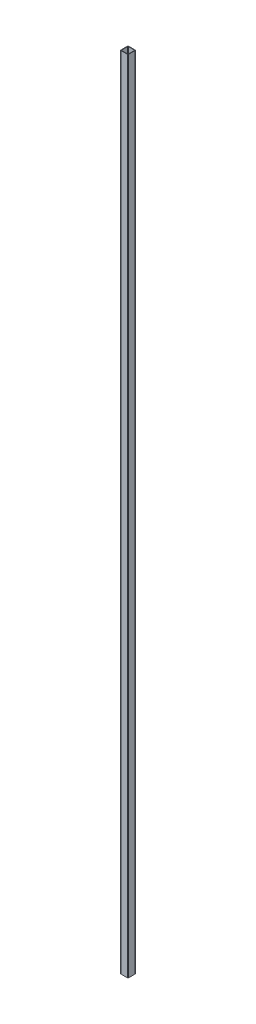
ISO-10303-21;
HEADER;
FILE_DESCRIPTION(('STEP AP214'),'2;1');
FILE_NAME('part.step','',(''),(''),'','','');
FILE_SCHEMA(('AUTOMOTIVE_DESIGN { 1 0 10303 214 1 1 1 1 }'));
ENDSEC;
DATA;
#1=APPLICATION_CONTEXT('core data for automotive mechanical design processes');
#2=APPLICATION_PROTOCOL_DEFINITION('international standard','automotive_design',2000,#1);
#3=PRODUCT_CONTEXT('',#1,'mechanical');
#4=PRODUCT('Part','Part','',(#3));
#5=PRODUCT_RELATED_PRODUCT_CATEGORY('part','',(#4));
#6=PRODUCT_DEFINITION_FORMATION('','',#4);
#7=PRODUCT_DEFINITION_CONTEXT('part definition',#1,'design');
#8=PRODUCT_DEFINITION('design','',#6,#7);
#9=PRODUCT_DEFINITION_SHAPE('','',#8);
#10=(LENGTH_UNIT() NAMED_UNIT(*) SI_UNIT(.MILLI.,.METRE.));
#11=(NAMED_UNIT(*) PLANE_ANGLE_UNIT() SI_UNIT($,.RADIAN.));
#12=(NAMED_UNIT(*) SI_UNIT($,.STERADIAN.) SOLID_ANGLE_UNIT());
#13=UNCERTAINTY_MEASURE_WITH_UNIT(LENGTH_MEASURE(1.E-05),#10,'distance_accuracy_value','');
#14=(GEOMETRIC_REPRESENTATION_CONTEXT(3) GLOBAL_UNCERTAINTY_ASSIGNED_CONTEXT((#13)) GLOBAL_UNIT_ASSIGNED_CONTEXT((#10,
#11,#12)) REPRESENTATION_CONTEXT('',''));
#15=CARTESIAN_POINT('',(0.,0.,0.));
#16=DIRECTION('',(0.,0.,1.));
#17=DIRECTION('',(1.,0.,0.));
#18=AXIS2_PLACEMENT_3D('',#15,#16,#17);
#19=CARTESIAN_POINT('',(18.,4240.,18.));
#20=DIRECTION('',(0.,-1.,0.));
#21=DIRECTION('',(0.,0.,-1.));
#22=AXIS2_PLACEMENT_3D('',#19,#20,#21);
#23=PLANE('',#22);
#24=CARTESIAN_POINT('',(18.,4240.,18.));
#25=DIRECTION('',(0.,1.,0.));
#26=DIRECTION('',(0.,0.,-1.));
#27=AXIS2_PLACEMENT_3D('',#24,#25,#26);
#28=CIRCLE('',#27,2.);
#29=CARTESIAN_POINT('',(18.,4240.,20.));
#30=VERTEX_POINT('',#29);
#31=CARTESIAN_POINT('',(20.,4240.,18.));
#32=VERTEX_POINT('',#31);
#33=EDGE_CURVE('E213',#30,#32,#28,.T.);
#34=ORIENTED_EDGE('',*,*,#33,.T.);
#35=DIRECTION('',(0.,0.,-1.));
#36=VECTOR('',#35,1.);
#37=CARTESIAN_POINT('',(20.,4240.,-18.));
#38=LINE('',#37,#36);
#39=CARTESIAN_POINT('',(20.,4240.,-18.));
#40=VERTEX_POINT('',#39);
#41=EDGE_CURVE('E216',#32,#40,#38,.T.);
#42=ORIENTED_EDGE('',*,*,#41,.T.);
#43=CARTESIAN_POINT('',(18.,4240.,-18.));
#44=DIRECTION('',(0.,1.,0.));
#45=DIRECTION('',(0.,0.,-1.));
#46=AXIS2_PLACEMENT_3D('',#43,#44,#45);
#47=CIRCLE('',#46,2.);
#48=CARTESIAN_POINT('',(18.,4240.,-20.));
#49=VERTEX_POINT('',#48);
#50=EDGE_CURVE('E219',#40,#49,#47,.T.);
#51=ORIENTED_EDGE('',*,*,#50,.T.);
#52=DIRECTION('',(-1.,0.,0.));
#53=VECTOR('',#52,1.);
#54=CARTESIAN_POINT('',(18.,4240.,-20.));
#55=LINE('',#54,#53);
#56=CARTESIAN_POINT('',(-18.,4240.,-20.));
#57=VERTEX_POINT('',#56);
#58=EDGE_CURVE('E221',#49,#57,#55,.T.);
#59=ORIENTED_EDGE('',*,*,#58,.T.);
#60=CARTESIAN_POINT('',(-18.,4240.,-18.));
#61=DIRECTION('',(0.,1.,0.));
#62=DIRECTION('',(0.,0.,1.));
#63=AXIS2_PLACEMENT_3D('',#60,#61,#62);
#64=CIRCLE('',#63,2.);
#65=CARTESIAN_POINT('',(-20.,4240.,-18.));
#66=VERTEX_POINT('',#65);
#67=EDGE_CURVE('E223',#57,#66,#64,.T.);
#68=ORIENTED_EDGE('',*,*,#67,.T.);
#69=DIRECTION('',(0.,0.,1.));
#70=VECTOR('',#69,1.);
#71=CARTESIAN_POINT('',(-20.,4240.,-18.));
#72=LINE('',#71,#70);
#73=CARTESIAN_POINT('',(-20.,4240.,18.));
#74=VERTEX_POINT('',#73);
#75=EDGE_CURVE('E225',#66,#74,#72,.T.);
#76=ORIENTED_EDGE('',*,*,#75,.T.);
#77=CARTESIAN_POINT('',(-18.,4240.,18.));
#78=DIRECTION('',(0.,1.,0.));
#79=DIRECTION('',(0.,0.,-1.));
#80=AXIS2_PLACEMENT_3D('',#77,#78,#79);
#81=CIRCLE('',#80,2.);
#82=CARTESIAN_POINT('',(-18.,4240.,20.));
#83=VERTEX_POINT('',#82);
#84=EDGE_CURVE('E227',#74,#83,#81,.T.);
#85=ORIENTED_EDGE('',*,*,#84,.T.);
#86=DIRECTION('',(1.,0.,0.));
#87=VECTOR('',#86,1.);
#88=CARTESIAN_POINT('',(18.,4240.,20.));
#89=LINE('',#88,#87);
#90=EDGE_CURVE('E229',#83,#30,#89,.T.);
#91=ORIENTED_EDGE('',*,*,#90,.T.);
#92=EDGE_LOOP('',(#34,#42,#51,#59,#68,#76,#85,#91));
#93=FACE_BOUND('',#92,.T.);
#94=CARTESIAN_POINT('',(16.,4240.,16.));
#95=DIRECTION('',(0.,1.,0.));
#96=DIRECTION('',(0.,0.,-1.));
#97=AXIS2_PLACEMENT_3D('',#94,#95,#96);
#98=CIRCLE('',#97,2.);
#99=CARTESIAN_POINT('',(16.,4240.,18.));
#100=VERTEX_POINT('',#99);
#101=CARTESIAN_POINT('',(18.,4240.,16.));
#102=VERTEX_POINT('',#101);
#103=EDGE_CURVE('E148',#100,#102,#98,.T.);
#104=ORIENTED_EDGE('',*,*,#103,.F.);
#105=DIRECTION('',(1.,0.,0.));
#106=VECTOR('',#105,1.);
#107=CARTESIAN_POINT('',(16.,4240.,18.));
#108=LINE('',#107,#106);
#109=CARTESIAN_POINT('',(-16.,4240.,18.));
#110=VERTEX_POINT('',#109);
#111=EDGE_CURVE('E181',#110,#100,#108,.T.);
#112=ORIENTED_EDGE('',*,*,#111,.F.);
#113=CARTESIAN_POINT('',(-16.,4240.,16.));
#114=DIRECTION('',(0.,1.,0.));
#115=DIRECTION('',(0.,0.,-1.));
#116=AXIS2_PLACEMENT_3D('',#113,#114,#115);
#117=CIRCLE('',#116,2.);
#118=CARTESIAN_POINT('',(-18.,4240.,16.));
#119=VERTEX_POINT('',#118);
#120=EDGE_CURVE('E179',#119,#110,#117,.T.);
#121=ORIENTED_EDGE('',*,*,#120,.F.);
#122=DIRECTION('',(0.,0.,1.));
#123=VECTOR('',#122,1.);
#124=CARTESIAN_POINT('',(-18.,4240.,-16.));
#125=LINE('',#124,#123);
#126=CARTESIAN_POINT('',(-18.,4240.,-16.));
#127=VERTEX_POINT('',#126);
#128=EDGE_CURVE('E177',#127,#119,#125,.T.);
#129=ORIENTED_EDGE('',*,*,#128,.F.);
#130=CARTESIAN_POINT('',(-16.,4240.,-16.));
#131=DIRECTION('',(0.,1.,0.));
#132=DIRECTION('',(0.,0.,1.));
#133=AXIS2_PLACEMENT_3D('',#130,#131,#132);
#134=CIRCLE('',#133,2.);
#135=CARTESIAN_POINT('',(-16.,4240.,-18.));
#136=VERTEX_POINT('',#135);
#137=EDGE_CURVE('E175',#136,#127,#134,.T.);
#138=ORIENTED_EDGE('',*,*,#137,.F.);
#139=DIRECTION('',(-1.,0.,0.));
#140=VECTOR('',#139,1.);
#141=CARTESIAN_POINT('',(16.,4240.,-18.));
#142=LINE('',#141,#140);
#143=CARTESIAN_POINT('',(16.,4240.,-18.));
#144=VERTEX_POINT('',#143);
#145=EDGE_CURVE('E171',#144,#136,#142,.T.);
#146=ORIENTED_EDGE('',*,*,#145,.F.);
#147=CARTESIAN_POINT('',(16.,4240.,-16.));
#148=DIRECTION('',(0.,1.,0.));
#149=DIRECTION('',(0.,0.,-1.));
#150=AXIS2_PLACEMENT_3D('',#147,#148,#149);
#151=CIRCLE('',#150,2.);
#152=CARTESIAN_POINT('',(18.,4240.,-16.));
#153=VERTEX_POINT('',#152);
#154=EDGE_CURVE('E169',#153,#144,#151,.T.);
#155=ORIENTED_EDGE('',*,*,#154,.F.);
#156=DIRECTION('',(0.,0.,-1.));
#157=VECTOR('',#156,1.);
#158=CARTESIAN_POINT('',(18.,4240.,-16.));
#159=LINE('',#158,#157);
#160=EDGE_CURVE('E156',#102,#153,#159,.T.);
#161=ORIENTED_EDGE('',*,*,#160,.F.);
#162=EDGE_LOOP('',(#104,#112,#121,#129,#138,#146,#155,#161));
#163=FACE_BOUND('',#162,.T.);
#164=ADVANCED_FACE('F35',(#93,#163),#23,.F.);
#165=CARTESIAN_POINT('',(18.,0.,18.));
#166=DIRECTION('',(0.,-1.,0.));
#167=DIRECTION('',(0.,0.,-1.));
#168=AXIS2_PLACEMENT_3D('',#165,#166,#167);
#169=PLANE('',#168);
#170=CARTESIAN_POINT('',(18.,0.,18.));
#171=DIRECTION('',(0.,1.,0.));
#172=DIRECTION('',(0.,0.,-1.));
#173=AXIS2_PLACEMENT_3D('',#170,#171,#172);
#174=CIRCLE('',#173,2.);
#175=CARTESIAN_POINT('',(18.,0.,20.));
#176=VERTEX_POINT('',#175);
#177=CARTESIAN_POINT('',(20.,0.,18.));
#178=VERTEX_POINT('',#177);
#179=EDGE_CURVE('E164',#176,#178,#174,.T.);
#180=ORIENTED_EDGE('',*,*,#179,.F.);
#181=DIRECTION('',(1.,0.,0.));
#182=VECTOR('',#181,1.);
#183=CARTESIAN_POINT('',(18.,0.,20.));
#184=LINE('',#183,#182);
#185=CARTESIAN_POINT('',(-18.,0.,20.));
#186=VERTEX_POINT('',#185);
#187=EDGE_CURVE('E217',#186,#176,#184,.T.);
#188=ORIENTED_EDGE('',*,*,#187,.F.);
#189=CARTESIAN_POINT('',(-18.,0.,18.));
#190=DIRECTION('',(0.,1.,0.));
#191=DIRECTION('',(0.,0.,-1.));
#192=AXIS2_PLACEMENT_3D('',#189,#190,#191);
#193=CIRCLE('',#192,2.);
#194=CARTESIAN_POINT('',(-20.,0.,18.));
#195=VERTEX_POINT('',#194);
#196=EDGE_CURVE('E244',#195,#186,#193,.T.);
#197=ORIENTED_EDGE('',*,*,#196,.F.);
#198=DIRECTION('',(0.,0.,1.));
#199=VECTOR('',#198,1.);
#200=CARTESIAN_POINT('',(-20.,0.,-18.));
#201=LINE('',#200,#199);
#202=CARTESIAN_POINT('',(-20.,0.,-18.));
#203=VERTEX_POINT('',#202);
#204=EDGE_CURVE('E242',#203,#195,#201,.T.);
#205=ORIENTED_EDGE('',*,*,#204,.F.);
#206=CARTESIAN_POINT('',(-18.,0.,-18.));
#207=DIRECTION('',(0.,1.,0.));
#208=DIRECTION('',(0.,0.,1.));
#209=AXIS2_PLACEMENT_3D('',#206,#207,#208);
#210=CIRCLE('',#209,2.);
#211=CARTESIAN_POINT('',(-18.,0.,-20.));
#212=VERTEX_POINT('',#211);
#213=EDGE_CURVE('E240',#212,#203,#210,.T.);
#214=ORIENTED_EDGE('',*,*,#213,.F.);
#215=DIRECTION('',(-1.,0.,0.));
#216=VECTOR('',#215,1.);
#217=CARTESIAN_POINT('',(18.,0.,-20.));
#218=LINE('',#217,#216);
#219=CARTESIAN_POINT('',(18.,0.,-20.));
#220=VERTEX_POINT('',#219);
#221=EDGE_CURVE('E238',#220,#212,#218,.T.);
#222=ORIENTED_EDGE('',*,*,#221,.F.);
#223=CARTESIAN_POINT('',(18.,0.,-18.));
#224=DIRECTION('',(0.,1.,0.));
#225=DIRECTION('',(0.,0.,-1.));
#226=AXIS2_PLACEMENT_3D('',#223,#224,#225);
#227=CIRCLE('',#226,2.);
#228=CARTESIAN_POINT('',(20.,0.,-18.));
#229=VERTEX_POINT('',#228);
#230=EDGE_CURVE('E236',#229,#220,#227,.T.);
#231=ORIENTED_EDGE('',*,*,#230,.F.);
#232=DIRECTION('',(0.,0.,-1.));
#233=VECTOR('',#232,1.);
#234=CARTESIAN_POINT('',(20.,0.,-18.));
#235=LINE('',#234,#233);
#236=EDGE_CURVE('E234',#178,#229,#235,.T.);
#237=ORIENTED_EDGE('',*,*,#236,.F.);
#238=EDGE_LOOP('',(#180,#188,#197,#205,#214,#222,#231,#237));
#239=FACE_BOUND('',#238,.T.);
#240=DIRECTION('',(1.,0.,0.));
#241=VECTOR('',#240,1.);
#242=CARTESIAN_POINT('',(16.,0.,18.));
#243=LINE('',#242,#241);
#244=CARTESIAN_POINT('',(-16.,0.,18.));
#245=VERTEX_POINT('',#244);
#246=CARTESIAN_POINT('',(16.,0.,18.));
#247=VERTEX_POINT('',#246);
#248=EDGE_CURVE('E157',#245,#247,#243,.T.);
#249=ORIENTED_EDGE('',*,*,#248,.T.);
#250=CARTESIAN_POINT('',(16.,0.,16.));
#251=DIRECTION('',(0.,1.,0.));
#252=DIRECTION('',(0.,0.,-1.));
#253=AXIS2_PLACEMENT_3D('',#250,#251,#252);
#254=CIRCLE('',#253,2.);
#255=CARTESIAN_POINT('',(18.,0.,16.));
#256=VERTEX_POINT('',#255);
#257=EDGE_CURVE('E58',#247,#256,#254,.T.);
#258=ORIENTED_EDGE('',*,*,#257,.T.);
#259=DIRECTION('',(0.,0.,-1.));
#260=VECTOR('',#259,1.);
#261=CARTESIAN_POINT('',(18.,0.,-16.));
#262=LINE('',#261,#260);
#263=CARTESIAN_POINT('',(18.,0.,-16.));
#264=VERTEX_POINT('',#263);
#265=EDGE_CURVE('E163',#256,#264,#262,.T.);
#266=ORIENTED_EDGE('',*,*,#265,.T.);
#267=CARTESIAN_POINT('',(16.,0.,-16.));
#268=DIRECTION('',(0.,1.,0.));
#269=DIRECTION('',(0.,0.,-1.));
#270=AXIS2_PLACEMENT_3D('',#267,#268,#269);
#271=CIRCLE('',#270,2.);
#272=CARTESIAN_POINT('',(16.,0.,-18.));
#273=VERTEX_POINT('',#272);
#274=EDGE_CURVE('E185',#264,#273,#271,.T.);
#275=ORIENTED_EDGE('',*,*,#274,.T.);
#276=DIRECTION('',(-1.,0.,0.));
#277=VECTOR('',#276,1.);
#278=CARTESIAN_POINT('',(16.,0.,-18.));
#279=LINE('',#278,#277);
#280=CARTESIAN_POINT('',(-16.,0.,-18.));
#281=VERTEX_POINT('',#280);
#282=EDGE_CURVE('E188',#273,#281,#279,.T.);
#283=ORIENTED_EDGE('',*,*,#282,.T.);
#284=CARTESIAN_POINT('',(-16.,0.,-16.));
#285=DIRECTION('',(0.,1.,0.));
#286=DIRECTION('',(0.,0.,1.));
#287=AXIS2_PLACEMENT_3D('',#284,#285,#286);
#288=CIRCLE('',#287,2.);
#289=CARTESIAN_POINT('',(-18.,0.,-16.));
#290=VERTEX_POINT('',#289);
#291=EDGE_CURVE('E191',#281,#290,#288,.T.);
#292=ORIENTED_EDGE('',*,*,#291,.T.);
#293=DIRECTION('',(0.,0.,1.));
#294=VECTOR('',#293,1.);
#295=CARTESIAN_POINT('',(-18.,0.,-16.));
#296=LINE('',#295,#294);
#297=CARTESIAN_POINT('',(-18.,0.,16.));
#298=VERTEX_POINT('',#297);
#299=EDGE_CURVE('E194',#290,#298,#296,.T.);
#300=ORIENTED_EDGE('',*,*,#299,.T.);
#301=CARTESIAN_POINT('',(-16.,0.,16.));
#302=DIRECTION('',(0.,1.,0.));
#303=DIRECTION('',(0.,0.,-1.));
#304=AXIS2_PLACEMENT_3D('',#301,#302,#303);
#305=CIRCLE('',#304,2.);
#306=EDGE_CURVE('E197',#298,#245,#305,.T.);
#307=ORIENTED_EDGE('',*,*,#306,.T.);
#308=EDGE_LOOP('',(#249,#258,#266,#275,#283,#292,#300,#307));
#309=FACE_BOUND('',#308,.T.);
#310=ADVANCED_FACE('F274',(#239,#309),#169,.T.);
#311=CARTESIAN_POINT('',(18.,4240.,18.));
#312=DIRECTION('',(0.,-1.,0.));
#313=DIRECTION('',(0.,0.,-1.));
#314=AXIS2_PLACEMENT_3D('',#311,#312,#313);
#315=CYLINDRICAL_SURFACE('',#314,2.);
#316=ORIENTED_EDGE('',*,*,#179,.T.);
#317=DIRECTION('',(0.,-1.,0.));
#318=VECTOR('',#317,1.);
#319=CARTESIAN_POINT('',(20.,4240.,18.));
#320=LINE('',#319,#318);
#321=EDGE_CURVE('E11',#32,#178,#320,.T.);
#322=ORIENTED_EDGE('',*,*,#321,.F.);
#323=ORIENTED_EDGE('',*,*,#33,.F.);
#324=DIRECTION('',(0.,-1.,0.));
#325=VECTOR('',#324,1.);
#326=CARTESIAN_POINT('',(18.,4240.,20.));
#327=LINE('',#326,#325);
#328=EDGE_CURVE('E231',#30,#176,#327,.T.);
#329=ORIENTED_EDGE('',*,*,#328,.T.);
#330=EDGE_LOOP('',(#316,#322,#323,#329));
#331=FACE_BOUND('',#330,.T.);
#332=ADVANCED_FACE('F37',(#331),#315,.T.);
#333=CARTESIAN_POINT('',(20.,4240.,-18.));
#334=DIRECTION('',(-1.,0.,0.));
#335=DIRECTION('',(0.,0.,1.));
#336=AXIS2_PLACEMENT_3D('',#333,#334,#335);
#337=PLANE('',#336);
#338=ORIENTED_EDGE('',*,*,#236,.T.);
#339=DIRECTION('',(0.,-1.,0.));
#340=VECTOR('',#339,1.);
#341=CARTESIAN_POINT('',(20.,4240.,-18.));
#342=LINE('',#341,#340);
#343=EDGE_CURVE('E43',#40,#229,#342,.T.);
#344=ORIENTED_EDGE('',*,*,#343,.F.);
#345=ORIENTED_EDGE('',*,*,#41,.F.);
#346=ORIENTED_EDGE('',*,*,#321,.T.);
#347=EDGE_LOOP('',(#338,#344,#345,#346));
#348=FACE_BOUND('',#347,.T.);
#349=ADVANCED_FACE('F291',(#348),#337,.F.);
#350=CARTESIAN_POINT('',(18.,4240.,-18.));
#351=DIRECTION('',(0.,-1.,0.));
#352=DIRECTION('',(0.,0.,-1.));
#353=AXIS2_PLACEMENT_3D('',#350,#351,#352);
#354=CYLINDRICAL_SURFACE('',#353,2.);
#355=ORIENTED_EDGE('',*,*,#230,.T.);
#356=DIRECTION('',(0.,-1.,0.));
#357=VECTOR('',#356,1.);
#358=CARTESIAN_POINT('',(18.,4240.,-20.));
#359=LINE('',#358,#357);
#360=EDGE_CURVE('E261',#49,#220,#359,.T.);
#361=ORIENTED_EDGE('',*,*,#360,.F.);
#362=ORIENTED_EDGE('',*,*,#50,.F.);
#363=ORIENTED_EDGE('',*,*,#343,.T.);
#364=EDGE_LOOP('',(#355,#361,#362,#363));
#365=FACE_BOUND('',#364,.T.);
#366=ADVANCED_FACE('F268',(#365),#354,.T.);
#367=CARTESIAN_POINT('',(18.,4240.,-20.));
#368=DIRECTION('',(0.,0.,1.));
#369=DIRECTION('',(1.,0.,0.));
#370=AXIS2_PLACEMENT_3D('',#367,#368,#369);
#371=PLANE('',#370);
#372=ORIENTED_EDGE('',*,*,#221,.T.);
#373=DIRECTION('',(0.,-1.,0.));
#374=VECTOR('',#373,1.);
#375=CARTESIAN_POINT('',(-18.,4240.,-20.));
#376=LINE('',#375,#374);
#377=EDGE_CURVE('E258',#57,#212,#376,.T.);
#378=ORIENTED_EDGE('',*,*,#377,.F.);
#379=ORIENTED_EDGE('',*,*,#58,.F.);
#380=ORIENTED_EDGE('',*,*,#360,.T.);
#381=EDGE_LOOP('',(#372,#378,#379,#380));
#382=FACE_BOUND('',#381,.T.);
#383=ADVANCED_FACE('F280',(#382),#371,.F.);
#384=CARTESIAN_POINT('',(-18.,4240.,-18.));
#385=DIRECTION('',(0.,-1.,0.));
#386=DIRECTION('',(0.,0.,-1.));
#387=AXIS2_PLACEMENT_3D('',#384,#385,#386);
#388=CYLINDRICAL_SURFACE('',#387,2.);
#389=ORIENTED_EDGE('',*,*,#213,.T.);
#390=DIRECTION('',(0.,-1.,0.));
#391=VECTOR('',#390,1.);
#392=CARTESIAN_POINT('',(-20.,4240.,-18.));
#393=LINE('',#392,#391);
#394=EDGE_CURVE('E255',#66,#203,#393,.T.);
#395=ORIENTED_EDGE('',*,*,#394,.F.);
#396=ORIENTED_EDGE('',*,*,#67,.F.);
#397=ORIENTED_EDGE('',*,*,#377,.T.);
#398=EDGE_LOOP('',(#389,#395,#396,#397));
#399=FACE_BOUND('',#398,.T.);
#400=ADVANCED_FACE('F284',(#399),#388,.T.);
#401=CARTESIAN_POINT('',(-20.,4240.,-18.));
#402=DIRECTION('',(1.,0.,0.));
#403=DIRECTION('',(0.,0.,-1.));
#404=AXIS2_PLACEMENT_3D('',#401,#402,#403);
#405=PLANE('',#404);
#406=ORIENTED_EDGE('',*,*,#204,.T.);
#407=DIRECTION('',(0.,-1.,0.));
#408=VECTOR('',#407,1.);
#409=CARTESIAN_POINT('',(-20.,4240.,18.));
#410=LINE('',#409,#408);
#411=EDGE_CURVE('E252',#74,#195,#410,.T.);
#412=ORIENTED_EDGE('',*,*,#411,.F.);
#413=ORIENTED_EDGE('',*,*,#75,.F.);
#414=ORIENTED_EDGE('',*,*,#394,.T.);
#415=EDGE_LOOP('',(#406,#412,#413,#414));
#416=FACE_BOUND('',#415,.T.);
#417=ADVANCED_FACE('F304',(#416),#405,.F.);
#418=CARTESIAN_POINT('',(-18.,4240.,18.));
#419=DIRECTION('',(0.,-1.,0.));
#420=DIRECTION('',(0.,0.,-1.));
#421=AXIS2_PLACEMENT_3D('',#418,#419,#420);
#422=CYLINDRICAL_SURFACE('',#421,2.);
#423=ORIENTED_EDGE('',*,*,#196,.T.);
#424=DIRECTION('',(0.,-1.,0.));
#425=VECTOR('',#424,1.);
#426=CARTESIAN_POINT('',(-18.,4240.,20.));
#427=LINE('',#426,#425);
#428=EDGE_CURVE('E249',#83,#186,#427,.T.);
#429=ORIENTED_EDGE('',*,*,#428,.F.);
#430=ORIENTED_EDGE('',*,*,#84,.F.);
#431=ORIENTED_EDGE('',*,*,#411,.T.);
#432=EDGE_LOOP('',(#423,#429,#430,#431));
#433=FACE_BOUND('',#432,.T.);
#434=ADVANCED_FACE('F302',(#433),#422,.T.);
#435=CARTESIAN_POINT('',(18.,4240.,20.));
#436=DIRECTION('',(0.,0.,-1.));
#437=DIRECTION('',(-1.,0.,0.));
#438=AXIS2_PLACEMENT_3D('',#435,#436,#437);
#439=PLANE('',#438);
#440=ORIENTED_EDGE('',*,*,#187,.T.);
#441=ORIENTED_EDGE('',*,*,#328,.F.);
#442=ORIENTED_EDGE('',*,*,#90,.F.);
#443=ORIENTED_EDGE('',*,*,#428,.T.);
#444=EDGE_LOOP('',(#440,#441,#442,#443));
#445=FACE_BOUND('',#444,.T.);
#446=ADVANCED_FACE('F297',(#445),#439,.F.);
#447=CARTESIAN_POINT('',(16.,4240.,16.));
#448=DIRECTION('',(0.,-1.,0.));
#449=DIRECTION('',(0.,0.,-1.));
#450=AXIS2_PLACEMENT_3D('',#447,#448,#449);
#451=CYLINDRICAL_SURFACE('',#450,2.);
#452=ORIENTED_EDGE('',*,*,#257,.F.);
#453=DIRECTION('',(0.,-1.,0.));
#454=VECTOR('',#453,1.);
#455=CARTESIAN_POINT('',(16.,4240.,18.));
#456=LINE('',#455,#454);
#457=EDGE_CURVE('E152',#100,#247,#456,.T.);
#458=ORIENTED_EDGE('',*,*,#457,.F.);
#459=ORIENTED_EDGE('',*,*,#103,.T.);
#460=DIRECTION('',(0.,-1.,0.));
#461=VECTOR('',#460,1.);
#462=CARTESIAN_POINT('',(18.,4240.,16.));
#463=LINE('',#462,#461);
#464=EDGE_CURVE('E151',#102,#256,#463,.T.);
#465=ORIENTED_EDGE('',*,*,#464,.T.);
#466=EDGE_LOOP('',(#452,#458,#459,#465));
#467=FACE_BOUND('',#466,.T.);
#468=ADVANCED_FACE('F150',(#467),#451,.F.);
#469=CARTESIAN_POINT('',(18.,4240.,-16.));
#470=DIRECTION('',(-1.,0.,0.));
#471=DIRECTION('',(0.,0.,1.));
#472=AXIS2_PLACEMENT_3D('',#469,#470,#471);
#473=PLANE('',#472);
#474=ORIENTED_EDGE('',*,*,#265,.F.);
#475=ORIENTED_EDGE('',*,*,#464,.F.);
#476=ORIENTED_EDGE('',*,*,#160,.T.);
#477=DIRECTION('',(0.,-1.,0.));
#478=VECTOR('',#477,1.);
#479=CARTESIAN_POINT('',(18.,4240.,-16.));
#480=LINE('',#479,#478);
#481=EDGE_CURVE('E165',#153,#264,#480,.T.);
#482=ORIENTED_EDGE('',*,*,#481,.T.);
#483=EDGE_LOOP('',(#474,#475,#476,#482));
#484=FACE_BOUND('',#483,.T.);
#485=ADVANCED_FACE('F160',(#484),#473,.T.);
#486=CARTESIAN_POINT('',(16.,4240.,-16.));
#487=DIRECTION('',(0.,-1.,0.));
#488=DIRECTION('',(0.,0.,-1.));
#489=AXIS2_PLACEMENT_3D('',#486,#487,#488);
#490=CYLINDRICAL_SURFACE('',#489,2.);
#491=ORIENTED_EDGE('',*,*,#274,.F.);
#492=ORIENTED_EDGE('',*,*,#481,.F.);
#493=ORIENTED_EDGE('',*,*,#154,.T.);
#494=DIRECTION('',(0.,-1.,0.));
#495=VECTOR('',#494,1.);
#496=CARTESIAN_POINT('',(16.,4240.,-18.));
#497=LINE('',#496,#495);
#498=EDGE_CURVE('E210',#144,#273,#497,.T.);
#499=ORIENTED_EDGE('',*,*,#498,.T.);
#500=EDGE_LOOP('',(#491,#492,#493,#499));
#501=FACE_BOUND('',#500,.T.);
#502=ADVANCED_FACE('F329',(#501),#490,.F.);
#503=CARTESIAN_POINT('',(16.,4240.,-18.));
#504=DIRECTION('',(0.,0.,1.));
#505=DIRECTION('',(1.,0.,0.));
#506=AXIS2_PLACEMENT_3D('',#503,#504,#505);
#507=PLANE('',#506);
#508=ORIENTED_EDGE('',*,*,#282,.F.);
#509=ORIENTED_EDGE('',*,*,#498,.F.);
#510=ORIENTED_EDGE('',*,*,#145,.T.);
#511=DIRECTION('',(0.,-1.,0.));
#512=VECTOR('',#511,1.);
#513=CARTESIAN_POINT('',(-16.,4240.,-18.));
#514=LINE('',#513,#512);
#515=EDGE_CURVE('E208',#136,#281,#514,.T.);
#516=ORIENTED_EDGE('',*,*,#515,.T.);
#517=EDGE_LOOP('',(#508,#509,#510,#516));
#518=FACE_BOUND('',#517,.T.);
#519=ADVANCED_FACE('F333',(#518),#507,.T.);
#520=CARTESIAN_POINT('',(-16.,4240.,-16.));
#521=DIRECTION('',(0.,-1.,0.));
#522=DIRECTION('',(0.,0.,-1.));
#523=AXIS2_PLACEMENT_3D('',#520,#521,#522);
#524=CYLINDRICAL_SURFACE('',#523,2.);
#525=ORIENTED_EDGE('',*,*,#291,.F.);
#526=ORIENTED_EDGE('',*,*,#515,.F.);
#527=ORIENTED_EDGE('',*,*,#137,.T.);
#528=DIRECTION('',(0.,-1.,0.));
#529=VECTOR('',#528,1.);
#530=CARTESIAN_POINT('',(-18.,4240.,-16.));
#531=LINE('',#530,#529);
#532=EDGE_CURVE('E206',#127,#290,#531,.T.);
#533=ORIENTED_EDGE('',*,*,#532,.T.);
#534=EDGE_LOOP('',(#525,#526,#527,#533));
#535=FACE_BOUND('',#534,.T.);
#536=ADVANCED_FACE('F339',(#535),#524,.F.);
#537=CARTESIAN_POINT('',(-18.,4240.,-16.));
#538=DIRECTION('',(1.,0.,0.));
#539=DIRECTION('',(0.,0.,-1.));
#540=AXIS2_PLACEMENT_3D('',#537,#538,#539);
#541=PLANE('',#540);
#542=ORIENTED_EDGE('',*,*,#299,.F.);
#543=ORIENTED_EDGE('',*,*,#532,.F.);
#544=ORIENTED_EDGE('',*,*,#128,.T.);
#545=DIRECTION('',(0.,-1.,0.));
#546=VECTOR('',#545,1.);
#547=CARTESIAN_POINT('',(-18.,4240.,16.));
#548=LINE('',#547,#546);
#549=EDGE_CURVE('E204',#119,#298,#548,.T.);
#550=ORIENTED_EDGE('',*,*,#549,.T.);
#551=EDGE_LOOP('',(#542,#543,#544,#550));
#552=FACE_BOUND('',#551,.T.);
#553=ADVANCED_FACE('F343',(#552),#541,.T.);
#554=CARTESIAN_POINT('',(-16.,4240.,16.));
#555=DIRECTION('',(0.,-1.,0.));
#556=DIRECTION('',(0.,0.,-1.));
#557=AXIS2_PLACEMENT_3D('',#554,#555,#556);
#558=CYLINDRICAL_SURFACE('',#557,2.);
#559=ORIENTED_EDGE('',*,*,#306,.F.);
#560=ORIENTED_EDGE('',*,*,#549,.F.);
#561=ORIENTED_EDGE('',*,*,#120,.T.);
#562=DIRECTION('',(0.,-1.,0.));
#563=VECTOR('',#562,1.);
#564=CARTESIAN_POINT('',(-16.,4240.,18.));
#565=LINE('',#564,#563);
#566=EDGE_CURVE('E50',#110,#245,#565,.T.);
#567=ORIENTED_EDGE('',*,*,#566,.T.);
#568=EDGE_LOOP('',(#559,#560,#561,#567));
#569=FACE_BOUND('',#568,.T.);
#570=ADVANCED_FACE('F347',(#569),#558,.F.);
#571=CARTESIAN_POINT('',(16.,4240.,18.));
#572=DIRECTION('',(0.,0.,-1.));
#573=DIRECTION('',(-1.,0.,0.));
#574=AXIS2_PLACEMENT_3D('',#571,#572,#573);
#575=PLANE('',#574);
#576=ORIENTED_EDGE('',*,*,#248,.F.);
#577=ORIENTED_EDGE('',*,*,#566,.F.);
#578=ORIENTED_EDGE('',*,*,#111,.T.);
#579=ORIENTED_EDGE('',*,*,#457,.T.);
#580=EDGE_LOOP('',(#576,#577,#578,#579));
#581=FACE_BOUND('',#580,.T.);
#582=ADVANCED_FACE('F351',(#581),#575,.T.);
#583=CLOSED_SHELL('',(#164,#310,#332,#349,#366,#383,#400,#417,#434,#446,#468,#485,#502,#519,
#536,#553,#570,#582));
#584=MANIFOLD_SOLID_BREP('B2',#583);
#585=ADVANCED_BREP_SHAPE_REPRESENTATION('',(#18,#584),#14);
#586=SHAPE_DEFINITION_REPRESENTATION(#9,#585);
ENDSEC;
END-ISO-10303-21;
